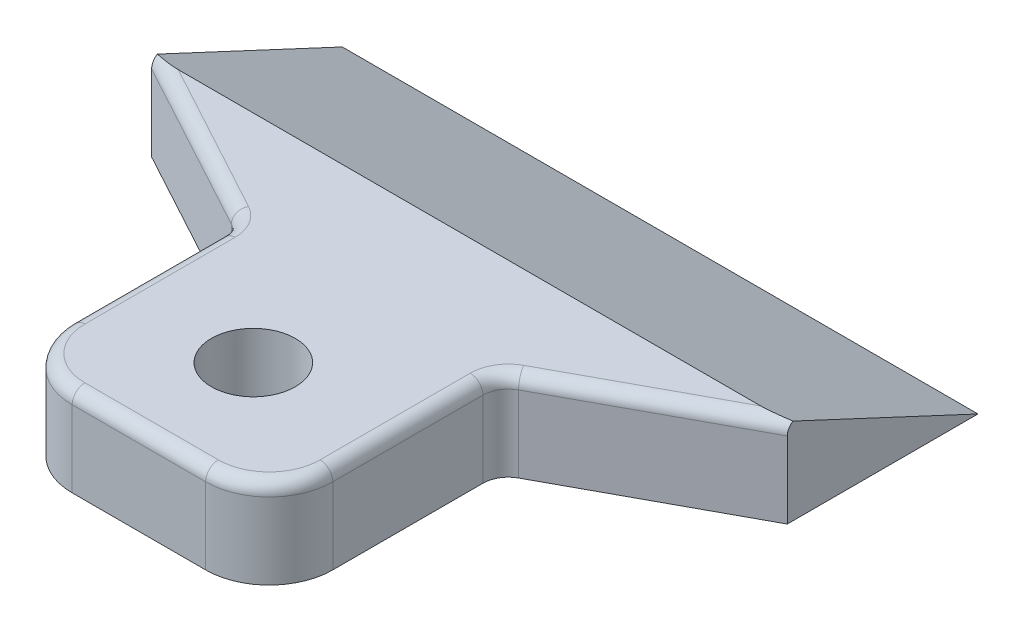
ISO-10303-21;
HEADER;
FILE_DESCRIPTION(('STEP AP214'),'2;1');
FILE_NAME('part.step','',(''),(''),'','','');
FILE_SCHEMA(('AUTOMOTIVE_DESIGN { 1 0 10303 214 1 1 1 1 }'));
ENDSEC;
DATA;
#1=APPLICATION_CONTEXT('core data for automotive mechanical design processes');
#2=APPLICATION_PROTOCOL_DEFINITION('international standard','automotive_design',2000,#1);
#3=PRODUCT_CONTEXT('',#1,'mechanical');
#4=PRODUCT('Part','Part','',(#3));
#5=PRODUCT_RELATED_PRODUCT_CATEGORY('part','',(#4));
#6=PRODUCT_DEFINITION_FORMATION('','',#4);
#7=PRODUCT_DEFINITION_CONTEXT('part definition',#1,'design');
#8=PRODUCT_DEFINITION('design','',#6,#7);
#9=PRODUCT_DEFINITION_SHAPE('','',#8);
#10=(LENGTH_UNIT() NAMED_UNIT(*) SI_UNIT(.MILLI.,.METRE.));
#11=(NAMED_UNIT(*) PLANE_ANGLE_UNIT() SI_UNIT($,.RADIAN.));
#12=(NAMED_UNIT(*) SI_UNIT($,.STERADIAN.) SOLID_ANGLE_UNIT());
#13=UNCERTAINTY_MEASURE_WITH_UNIT(LENGTH_MEASURE(1.E-05),#10,'distance_accuracy_value','');
#14=(GEOMETRIC_REPRESENTATION_CONTEXT(3) GLOBAL_UNCERTAINTY_ASSIGNED_CONTEXT((#13)) GLOBAL_UNIT_ASSIGNED_CONTEXT((#10,
#11,#12)) REPRESENTATION_CONTEXT('',''));
#15=CARTESIAN_POINT('',(0.,0.,0.));
#16=DIRECTION('',(0.,0.,1.));
#17=DIRECTION('',(1.,0.,0.));
#18=AXIS2_PLACEMENT_3D('',#15,#16,#17);
#19=CARTESIAN_POINT('',(5.25,0.,-5.));
#20=DIRECTION('',(0.,1.,0.));
#21=DIRECTION('',(0.,0.,1.));
#22=AXIS2_PLACEMENT_3D('',#19,#20,#21);
#23=PLANE('',#22);
#24=DIRECTION('',(0.,0.,1.));
#25=VECTOR('',#24,1.);
#26=CARTESIAN_POINT('',(-15.,0.,-5.));
#27=LINE('',#26,#25);
#28=CARTESIAN_POINT('',(-15.,0.,-41.));
#29=VERTEX_POINT('',#28);
#30=CARTESIAN_POINT('',(-15.,0.,-36.));
#31=VERTEX_POINT('',#30);
#32=EDGE_CURVE('E398',#29,#31,#27,.T.);
#33=ORIENTED_EDGE('',*,*,#32,.F.);
#34=DIRECTION('',(-1.,0.,0.));
#35=VECTOR('',#34,1.);
#36=CARTESIAN_POINT('',(25.,0.,-41.));
#37=LINE('',#36,#35);
#38=CARTESIAN_POINT('',(15.,0.,-41.));
#39=VERTEX_POINT('',#38);
#40=EDGE_CURVE('E333',#39,#29,#37,.T.);
#41=ORIENTED_EDGE('',*,*,#40,.F.);
#42=DIRECTION('',(0.,0.,-1.));
#43=VECTOR('',#42,1.);
#44=CARTESIAN_POINT('',(15.,0.,-5.));
#45=LINE('',#44,#43);
#46=CARTESIAN_POINT('',(15.,0.,-36.));
#47=VERTEX_POINT('',#46);
#48=EDGE_CURVE('E330',#47,#39,#45,.T.);
#49=ORIENTED_EDGE('',*,*,#48,.F.);
#50=DIRECTION('',(-1.,0.,0.));
#51=VECTOR('',#50,1.);
#52=CARTESIAN_POINT('',(5.25,0.,-36.));
#53=LINE('',#52,#51);
#54=CARTESIAN_POINT('',(25.,0.,-36.));
#55=VERTEX_POINT('',#54);
#56=EDGE_CURVE('E392',#55,#47,#53,.T.);
#57=ORIENTED_EDGE('',*,*,#56,.F.);
#58=DIRECTION('',(0.,0.,-1.));
#59=VECTOR('',#58,1.);
#60=CARTESIAN_POINT('',(25.,0.,-26.));
#61=LINE('',#60,#59);
#62=CARTESIAN_POINT('',(25.,0.,-26.));
#63=VERTEX_POINT('',#62);
#64=EDGE_CURVE('E324',#63,#55,#61,.T.);
#65=ORIENTED_EDGE('',*,*,#64,.F.);
#66=DIRECTION('',(1.,0.,0.));
#67=VECTOR('',#66,1.);
#68=CARTESIAN_POINT('',(5.25,0.,-26.));
#69=LINE('',#68,#67);
#70=CARTESIAN_POINT('',(-25.,0.,-26.));
#71=VERTEX_POINT('',#70);
#72=EDGE_CURVE('E372',#71,#63,#69,.T.);
#73=ORIENTED_EDGE('',*,*,#72,.F.);
#74=DIRECTION('',(0.,0.,1.));
#75=VECTOR('',#74,1.);
#76=CARTESIAN_POINT('',(-25.,0.,-26.));
#77=LINE('',#76,#75);
#78=CARTESIAN_POINT('',(-25.,0.,-36.));
#79=VERTEX_POINT('',#78);
#80=EDGE_CURVE('E332',#79,#71,#77,.T.);
#81=ORIENTED_EDGE('',*,*,#80,.F.);
#82=DIRECTION('',(-1.,0.,0.));
#83=VECTOR('',#82,1.);
#84=CARTESIAN_POINT('',(5.25,0.,-36.));
#85=LINE('',#84,#83);
#86=EDGE_CURVE('E395',#31,#79,#85,.T.);
#87=ORIENTED_EDGE('',*,*,#86,.F.);
#88=EDGE_LOOP('',(#33,#41,#49,#57,#65,#73,#81,#87));
#89=FACE_BOUND('',#88,.T.);
#90=ADVANCED_FACE('F166',(#89),#23,.F.);
#91=CARTESIAN_POINT('',(-25.,0.,-41.));
#92=VERTEX_POINT('',#91);
#93=EDGE_CURVE('E335',#29,#92,#37,.T.);
#94=ORIENTED_EDGE('',*,*,#93,.F.);
#95=ORIENTED_EDGE('',*,*,#32,.T.);
#96=ORIENTED_EDGE('',*,*,#86,.T.);
#97=EDGE_CURVE('E337',#92,#79,#77,.T.);
#98=ORIENTED_EDGE('',*,*,#97,.F.);
#99=EDGE_LOOP('',(#94,#95,#96,#98));
#100=FACE_BOUND('',#99,.T.);
#101=ADVANCED_FACE('F553',(#100),#23,.F.);
#102=CARTESIAN_POINT('',(25.,0.,-41.));
#103=VERTEX_POINT('',#102);
#104=EDGE_CURVE('E321',#55,#103,#61,.T.);
#105=ORIENTED_EDGE('',*,*,#104,.F.);
#106=ORIENTED_EDGE('',*,*,#56,.T.);
#107=ORIENTED_EDGE('',*,*,#48,.T.);
#108=EDGE_CURVE('E310',#103,#39,#37,.T.);
#109=ORIENTED_EDGE('',*,*,#108,.F.);
#110=EDGE_LOOP('',(#105,#106,#107,#109));
#111=FACE_BOUND('',#110,.T.);
#112=ADVANCED_FACE('F328',(#111),#23,.F.);
#113=CARTESIAN_POINT('',(0.,7.,-9.));
#114=DIRECTION('',(0.,-1.,0.));
#115=DIRECTION('',(0.,0.,-1.));
#116=AXIS2_PLACEMENT_3D('',#113,#114,#115);
#117=CYLINDRICAL_SURFACE('',#116,3.3);
#118=CARTESIAN_POINT('',(0.,7.,-9.));
#119=DIRECTION('',(0.,1.,0.));
#120=DIRECTION('',(0.,0.,1.));
#121=AXIS2_PLACEMENT_3D('',#118,#119,#120);
#122=CIRCLE('',#121,3.3);
#123=CARTESIAN_POINT('',(0.,7.,-5.7));
#124=VERTEX_POINT('',#123);
#125=EDGE_CURVE('E351',#124,#124,#122,.T.);
#126=ORIENTED_EDGE('',*,*,#125,.T.);
#127=EDGE_LOOP('',(#126));
#128=FACE_BOUND('',#127,.T.);
#129=CARTESIAN_POINT('',(0.,2.,-9.));
#130=DIRECTION('',(0.,-1.,0.));
#131=DIRECTION('',(0.,0.,-1.));
#132=AXIS2_PLACEMENT_3D('',#129,#130,#131);
#133=CIRCLE('',#132,3.3);
#134=CARTESIAN_POINT('',(0.,2.,-12.3));
#135=VERTEX_POINT('',#134);
#136=EDGE_CURVE('E317',#135,#135,#133,.T.);
#137=ORIENTED_EDGE('',*,*,#136,.T.);
#138=EDGE_LOOP('',(#137));
#139=FACE_BOUND('',#138,.T.);
#140=ADVANCED_FACE('F582',(#128,#139),#117,.F.);
#141=CARTESIAN_POINT('',(5.25,7.,-5.));
#142=DIRECTION('',(0.,1.,0.));
#143=DIRECTION('',(0.,0.,1.));
#144=AXIS2_PLACEMENT_3D('',#141,#142,#143);
#145=PLANE('',#144);
#146=DIRECTION('',(1.,0.,0.));
#147=VECTOR('',#146,1.);
#148=CARTESIAN_POINT('',(-25.,7.,-26.));
#149=LINE('',#148,#147);
#150=CARTESIAN_POINT('',(-22.9025219756813,7.,-26.));
#151=VERTEX_POINT('',#150);
#152=CARTESIAN_POINT('',(22.9025219756813,7.,-26.));
#153=VERTEX_POINT('',#152);
#154=EDGE_CURVE('E354',#151,#153,#149,.T.);
#155=ORIENTED_EDGE('',*,*,#154,.F.);
#156=DIRECTION('',(0.879031855696728,0.,0.476763040377887));
#157=VECTOR('',#156,1.);
#158=CARTESIAN_POINT('',(-10.8197108788663,7.,-19.446610930541));
#159=LINE('',#158,#157);
#160=CARTESIAN_POINT('',(-10.8197108788663,7.,-19.446610930541));
#161=VERTEX_POINT('',#160);
#162=EDGE_CURVE('E417',#151,#161,#159,.T.);
#163=ORIENTED_EDGE('',*,*,#162,.T.);
#164=CARTESIAN_POINT('',(-12.25,7.,-16.8095153634509));
#165=DIRECTION('',(0.,1.,0.));
#166=DIRECTION('',(0.,0.,1.));
#167=AXIS2_PLACEMENT_3D('',#164,#165,#166);
#168=CIRCLE('',#167,3.);
#169=CARTESIAN_POINT('',(-9.24999999999999,7.,-16.8095153634509));
#170=VERTEX_POINT('',#169);
#171=EDGE_CURVE('E415',#161,#170,#168,.F.);
#172=ORIENTED_EDGE('',*,*,#171,.T.);
#173=DIRECTION('',(0.,0.,1.));
#174=VECTOR('',#173,1.);
#175=CARTESIAN_POINT('',(-9.24999999999999,7.,-5.));
#176=LINE('',#175,#174);
#177=CARTESIAN_POINT('',(-9.24999999999999,7.,-5.));
#178=VERTEX_POINT('',#177);
#179=EDGE_CURVE('E401',#170,#178,#176,.T.);
#180=ORIENTED_EDGE('',*,*,#179,.T.);
#181=CARTESIAN_POINT('',(-5.24999999999999,7.,-5.));
#182=DIRECTION('',(0.,1.,0.));
#183=DIRECTION('',(0.,0.,1.));
#184=AXIS2_PLACEMENT_3D('',#181,#182,#183);
#185=CIRCLE('',#184,4.);
#186=CARTESIAN_POINT('',(-5.24999999999999,7.,-1.));
#187=VERTEX_POINT('',#186);
#188=EDGE_CURVE('E403',#178,#187,#185,.T.);
#189=ORIENTED_EDGE('',*,*,#188,.T.);
#190=DIRECTION('',(1.,0.,0.));
#191=VECTOR('',#190,1.);
#192=CARTESIAN_POINT('',(5.25,7.,-0.999999999999999));
#193=LINE('',#192,#191);
#194=CARTESIAN_POINT('',(5.25,7.,-0.999999999999999));
#195=VERTEX_POINT('',#194);
#196=EDGE_CURVE('E405',#187,#195,#193,.T.);
#197=ORIENTED_EDGE('',*,*,#196,.T.);
#198=CARTESIAN_POINT('',(5.25,7.,-5.));
#199=DIRECTION('',(0.,1.,0.));
#200=DIRECTION('',(0.,0.,1.));
#201=AXIS2_PLACEMENT_3D('',#198,#199,#200);
#202=CIRCLE('',#201,4.);
#203=CARTESIAN_POINT('',(9.25,7.,-5.));
#204=VERTEX_POINT('',#203);
#205=EDGE_CURVE('E407',#195,#204,#202,.T.);
#206=ORIENTED_EDGE('',*,*,#205,.T.);
#207=DIRECTION('',(0.,0.,-1.));
#208=VECTOR('',#207,1.);
#209=CARTESIAN_POINT('',(9.25,7.,-16.8095153634509));
#210=LINE('',#209,#208);
#211=CARTESIAN_POINT('',(9.25,7.,-16.8095153634509));
#212=VERTEX_POINT('',#211);
#213=EDGE_CURVE('E409',#204,#212,#210,.T.);
#214=ORIENTED_EDGE('',*,*,#213,.T.);
#215=CARTESIAN_POINT('',(12.25,7.,-16.8095153634509));
#216=DIRECTION('',(0.,1.,0.));
#217=DIRECTION('',(0.,0.,1.));
#218=AXIS2_PLACEMENT_3D('',#215,#216,#217);
#219=CIRCLE('',#218,3.);
#220=CARTESIAN_POINT('',(10.8197108788663,7.,-19.4466109305411));
#221=VERTEX_POINT('',#220);
#222=EDGE_CURVE('E411',#212,#221,#219,.F.);
#223=ORIENTED_EDGE('',*,*,#222,.T.);
#224=DIRECTION('',(0.879031855696728,0.,-0.476763040377887));
#225=VECTOR('',#224,1.);
#226=CARTESIAN_POINT('',(24.5232369596221,7.,-26.8790318556967));
#227=LINE('',#226,#225);
#228=EDGE_CURVE('E413',#221,#153,#227,.T.);
#229=ORIENTED_EDGE('',*,*,#228,.T.);
#230=EDGE_LOOP('',(#155,#163,#172,#180,#189,#197,#206,#214,#223,#229));
#231=FACE_BOUND('',#230,.T.);
#232=ORIENTED_EDGE('',*,*,#125,.F.);
#233=EDGE_LOOP('',(#232));
#234=FACE_BOUND('',#233,.T.);
#235=ADVANCED_FACE('F474',(#231,#234),#145,.T.);
#236=CARTESIAN_POINT('',(0.,0.,-9.));
#237=DIRECTION('',(0.,-1.,0.));
#238=DIRECTION('',(0.,0.,-1.));
#239=AXIS2_PLACEMENT_3D('',#236,#237,#238);
#240=CIRCLE('',#239,7.);
#241=CARTESIAN_POINT('',(0.,0.,-16.));
#242=VERTEX_POINT('',#241);
#243=EDGE_CURVE('E357',#242,#242,#240,.T.);
#244=ORIENTED_EDGE('',*,*,#243,.F.);
#245=EDGE_LOOP('',(#244));
#246=FACE_BOUND('',#245,.T.);
#247=DIRECTION('',(0.879031855696728,0.,0.476763040377887));
#248=VECTOR('',#247,1.);
#249=CARTESIAN_POINT('',(-10.25,0.,-18.));
#250=LINE('',#249,#248);
#251=CARTESIAN_POINT('',(-11.2964739192442,0.,-18.5675790748443));
#252=VERTEX_POINT('',#251);
#253=EDGE_CURVE('E504',#71,#252,#250,.T.);
#254=ORIENTED_EDGE('',*,*,#253,.F.);
#255=ORIENTED_EDGE('',*,*,#72,.T.);
#256=DIRECTION('',(0.879031855696728,0.,-0.476763040377887));
#257=VECTOR('',#256,1.);
#258=CARTESIAN_POINT('',(10.25,0.,-18.));
#259=LINE('',#258,#257);
#260=CARTESIAN_POINT('',(11.2964739192442,0.,-18.5675790748443));
#261=VERTEX_POINT('',#260);
#262=EDGE_CURVE('E326',#261,#63,#259,.T.);
#263=ORIENTED_EDGE('',*,*,#262,.F.);
#264=CARTESIAN_POINT('',(12.25,0.,-16.8095153634509));
#265=DIRECTION('',(0.,1.,0.));
#266=DIRECTION('',(0.,0.,1.));
#267=AXIS2_PLACEMENT_3D('',#264,#265,#266);
#268=CIRCLE('',#267,2.);
#269=CARTESIAN_POINT('',(10.25,0.,-16.8095153634509));
#270=VERTEX_POINT('',#269);
#271=EDGE_CURVE('E386',#261,#270,#268,.T.);
#272=ORIENTED_EDGE('',*,*,#271,.T.);
#273=DIRECTION('',(0.,0.,-1.));
#274=VECTOR('',#273,1.);
#275=CARTESIAN_POINT('',(10.25,0.,-5.));
#276=LINE('',#275,#274);
#277=CARTESIAN_POINT('',(10.25,0.,-5.));
#278=VERTEX_POINT('',#277);
#279=EDGE_CURVE('E345',#278,#270,#276,.T.);
#280=ORIENTED_EDGE('',*,*,#279,.F.);
#281=CARTESIAN_POINT('',(5.25,0.,-5.));
#282=DIRECTION('',(0.,1.,0.));
#283=DIRECTION('',(0.,0.,1.));
#284=AXIS2_PLACEMENT_3D('',#281,#282,#283);
#285=CIRCLE('',#284,5.);
#286=CARTESIAN_POINT('',(5.25,0.,0.));
#287=VERTEX_POINT('',#286);
#288=EDGE_CURVE('E348',#287,#278,#285,.T.);
#289=ORIENTED_EDGE('',*,*,#288,.F.);
#290=DIRECTION('',(1.,0.,0.));
#291=VECTOR('',#290,1.);
#292=CARTESIAN_POINT('',(-5.24999999999999,0.,0.));
#293=LINE('',#292,#291);
#294=CARTESIAN_POINT('',(-5.24999999999999,0.,0.));
#295=VERTEX_POINT('',#294);
#296=EDGE_CURVE('E516',#295,#287,#293,.T.);
#297=ORIENTED_EDGE('',*,*,#296,.F.);
#298=CARTESIAN_POINT('',(-5.24999999999999,0.,-5.));
#299=DIRECTION('',(0.,1.,0.));
#300=DIRECTION('',(0.,0.,1.));
#301=AXIS2_PLACEMENT_3D('',#298,#299,#300);
#302=CIRCLE('',#301,5.);
#303=CARTESIAN_POINT('',(-10.25,0.,-5.));
#304=VERTEX_POINT('',#303);
#305=EDGE_CURVE('E510',#304,#295,#302,.T.);
#306=ORIENTED_EDGE('',*,*,#305,.F.);
#307=DIRECTION('',(0.,0.,1.));
#308=VECTOR('',#307,1.);
#309=CARTESIAN_POINT('',(-10.25,0.,-18.));
#310=LINE('',#309,#308);
#311=CARTESIAN_POINT('',(-10.25,0.,-16.8095153634509));
#312=VERTEX_POINT('',#311);
#313=EDGE_CURVE('E507',#312,#304,#310,.T.);
#314=ORIENTED_EDGE('',*,*,#313,.F.);
#315=CARTESIAN_POINT('',(-12.25,0.,-16.8095153634509));
#316=DIRECTION('',(0.,1.,0.));
#317=DIRECTION('',(0.,0.,1.));
#318=AXIS2_PLACEMENT_3D('',#315,#316,#317);
#319=CIRCLE('',#318,2.);
#320=EDGE_CURVE('E388',#312,#252,#319,.T.);
#321=ORIENTED_EDGE('',*,*,#320,.T.);
#322=EDGE_LOOP('',(#254,#255,#263,#272,#280,#289,#297,#306,#314,#321));
#323=FACE_BOUND('',#322,.T.);
#324=ADVANCED_FACE('F537',(#246,#323),#23,.F.);
#325=CARTESIAN_POINT('',(5.25,7.,-5.));
#326=DIRECTION('',(0.,-1.,0.));
#327=DIRECTION('',(0.,0.,-1.));
#328=AXIS2_PLACEMENT_3D('',#325,#326,#327);
#329=CYLINDRICAL_SURFACE('',#328,5.);
#330=DIRECTION('',(0.,-1.,0.));
#331=VECTOR('',#330,1.);
#332=CARTESIAN_POINT('',(10.25,7.,-5.));
#333=LINE('',#332,#331);
#334=CARTESIAN_POINT('',(10.25,6.,-5.));
#335=VERTEX_POINT('',#334);
#336=EDGE_CURVE('E525',#335,#278,#333,.T.);
#337=ORIENTED_EDGE('',*,*,#336,.F.);
#338=CARTESIAN_POINT('',(5.25,6.,-5.));
#339=DIRECTION('',(0.,1.,0.));
#340=DIRECTION('',(0.,0.,1.));
#341=AXIS2_PLACEMENT_3D('',#338,#339,#340);
#342=CIRCLE('',#341,5.);
#343=CARTESIAN_POINT('',(5.25,6.,0.));
#344=VERTEX_POINT('',#343);
#345=EDGE_CURVE('E437',#335,#344,#342,.F.);
#346=ORIENTED_EDGE('',*,*,#345,.T.);
#347=DIRECTION('',(0.,-1.,0.));
#348=VECTOR('',#347,1.);
#349=CARTESIAN_POINT('',(5.25,7.,0.));
#350=LINE('',#349,#348);
#351=EDGE_CURVE('E370',#344,#287,#350,.T.);
#352=ORIENTED_EDGE('',*,*,#351,.T.);
#353=ORIENTED_EDGE('',*,*,#288,.T.);
#354=EDGE_LOOP('',(#337,#346,#352,#353));
#355=FACE_BOUND('',#354,.T.);
#356=ADVANCED_FACE('F529',(#355),#329,.T.);
#357=CARTESIAN_POINT('',(10.25,7.,-5.));
#358=DIRECTION('',(-1.,0.,0.));
#359=DIRECTION('',(0.,0.,1.));
#360=AXIS2_PLACEMENT_3D('',#357,#358,#359);
#361=PLANE('',#360);
#362=DIRECTION('',(0.,-1.,0.));
#363=VECTOR('',#362,1.);
#364=CARTESIAN_POINT('',(10.25,7.,-16.8095153634509));
#365=LINE('',#364,#363);
#366=CARTESIAN_POINT('',(10.25,6.,-16.8095153634509));
#367=VERTEX_POINT('',#366);
#368=EDGE_CURVE('E378',#270,#367,#365,.F.);
#369=ORIENTED_EDGE('',*,*,#368,.T.);
#370=DIRECTION('',(0.,0.,-1.));
#371=VECTOR('',#370,1.);
#372=CARTESIAN_POINT('',(10.25,6.,-5.));
#373=LINE('',#372,#371);
#374=EDGE_CURVE('E435',#367,#335,#373,.F.);
#375=ORIENTED_EDGE('',*,*,#374,.T.);
#376=ORIENTED_EDGE('',*,*,#336,.T.);
#377=ORIENTED_EDGE('',*,*,#279,.T.);
#378=EDGE_LOOP('',(#369,#375,#376,#377));
#379=FACE_BOUND('',#378,.T.);
#380=ADVANCED_FACE('F541',(#379),#361,.F.);
#381=CARTESIAN_POINT('',(10.25,7.,-18.));
#382=DIRECTION('',(-0.476763040377887,0.,-0.879031855696728));
#383=DIRECTION('',(-0.879031855696728,0.,0.476763040377887));
#384=AXIS2_PLACEMENT_3D('',#381,#382,#383);
#385=PLANE('',#384);
#386=DIRECTION('',(0.,-1.,0.));
#387=VECTOR('',#386,1.);
#388=CARTESIAN_POINT('',(25.,7.,-26.));
#389=LINE('',#388,#387);
#390=CARTESIAN_POINT('',(25.,6.,-26.));
#391=VERTEX_POINT('',#390);
#392=EDGE_CURVE('E524',#391,#63,#389,.T.);
#393=ORIENTED_EDGE('',*,*,#392,.F.);
#394=DIRECTION('',(0.879031855696728,0.,-0.476763040377887));
#395=VECTOR('',#394,1.);
#396=CARTESIAN_POINT('',(11.2964739192442,6.,-18.5675790748443));
#397=LINE('',#396,#395);
#398=CARTESIAN_POINT('',(11.2964739192442,6.,-18.5675790748443));
#399=VERTEX_POINT('',#398);
#400=EDGE_CURVE('E431',#391,#399,#397,.F.);
#401=ORIENTED_EDGE('',*,*,#400,.T.);
#402=DIRECTION('',(0.,-1.,0.));
#403=VECTOR('',#402,1.);
#404=CARTESIAN_POINT('',(11.2964739192442,0.,-18.5675790748443));
#405=LINE('',#404,#403);
#406=EDGE_CURVE('E376',#399,#261,#405,.T.);
#407=ORIENTED_EDGE('',*,*,#406,.T.);
#408=ORIENTED_EDGE('',*,*,#262,.T.);
#409=EDGE_LOOP('',(#393,#401,#407,#408));
#410=FACE_BOUND('',#409,.T.);
#411=ADVANCED_FACE('F547',(#410),#385,.F.);
#412=CARTESIAN_POINT('',(25.,7.,-26.));
#413=DIRECTION('',(-1.,0.,0.));
#414=DIRECTION('',(0.,0.,1.));
#415=AXIS2_PLACEMENT_3D('',#412,#413,#414);
#416=PLANE('',#415);
#417=DIRECTION('',(0.,-0.422885465331124,-0.906183139995265));
#418=VECTOR('',#417,1.);
#419=CARTESIAN_POINT('',(25.,7.,-26.));
#420=LINE('',#419,#418);
#421=CARTESIAN_POINT('',(25.,6.79272840476207,-26.444153418367));
#422=VERTEX_POINT('',#421);
#423=EDGE_CURVE('E304',#422,#103,#420,.T.);
#424=ORIENTED_EDGE('',*,*,#423,.F.);
#425=CARTESIAN_POINT('',(25.,6.,-27.1376151996305));
#426=DIRECTION('',(-1.,0.,0.));
#427=DIRECTION('',(0.,0.,1.));
#428=AXIS2_PLACEMENT_3D('',#425,#426,#427);
#429=ELLIPSE('',#428,1.1376151996305,1.);
#430=EDGE_CURVE('E429',#422,#391,#429,.F.);
#431=ORIENTED_EDGE('',*,*,#430,.T.);
#432=ORIENTED_EDGE('',*,*,#392,.T.);
#433=ORIENTED_EDGE('',*,*,#64,.T.);
#434=ORIENTED_EDGE('',*,*,#104,.T.);
#435=EDGE_LOOP('',(#424,#431,#432,#433,#434));
#436=FACE_BOUND('',#435,.T.);
#437=ADVANCED_FACE('F322',(#436),#416,.F.);
#438=CARTESIAN_POINT('',(-25.,7.,-26.));
#439=DIRECTION('',(1.,0.,0.));
#440=DIRECTION('',(0.,0.,-1.));
#441=AXIS2_PLACEMENT_3D('',#438,#439,#440);
#442=PLANE('',#441);
#443=DIRECTION('',(0.,-1.,0.));
#444=VECTOR('',#443,1.);
#445=CARTESIAN_POINT('',(-25.,7.,-26.));
#446=LINE('',#445,#444);
#447=CARTESIAN_POINT('',(-25.,6.,-26.));
#448=VERTEX_POINT('',#447);
#449=EDGE_CURVE('E505',#448,#71,#446,.T.);
#450=ORIENTED_EDGE('',*,*,#449,.F.);
#451=CARTESIAN_POINT('',(-25.,6.,-27.1376151996305));
#452=DIRECTION('',(1.,0.,0.));
#453=DIRECTION('',(0.,0.,-1.));
#454=AXIS2_PLACEMENT_3D('',#451,#452,#453);
#455=ELLIPSE('',#454,1.1376151996305,1.);
#456=CARTESIAN_POINT('',(-25.,6.79272840476207,-26.444153418367));
#457=VERTEX_POINT('',#456);
#458=EDGE_CURVE('E422',#448,#457,#455,.F.);
#459=ORIENTED_EDGE('',*,*,#458,.T.);
#460=DIRECTION('',(0.,-0.422885465331124,-0.906183139995265));
#461=VECTOR('',#460,1.);
#462=CARTESIAN_POINT('',(-25.,7.,-26.));
#463=LINE('',#462,#461);
#464=EDGE_CURVE('E316',#457,#92,#463,.T.);
#465=ORIENTED_EDGE('',*,*,#464,.T.);
#466=ORIENTED_EDGE('',*,*,#97,.T.);
#467=ORIENTED_EDGE('',*,*,#80,.T.);
#468=EDGE_LOOP('',(#450,#459,#465,#466,#467));
#469=FACE_BOUND('',#468,.T.);
#470=ADVANCED_FACE('F555',(#469),#442,.F.);
#471=CARTESIAN_POINT('',(-10.25,7.,-18.));
#472=DIRECTION('',(0.476763040377887,0.,-0.879031855696728));
#473=DIRECTION('',(-0.879031855696728,0.,-0.476763040377887));
#474=AXIS2_PLACEMENT_3D('',#471,#472,#473);
#475=PLANE('',#474);
#476=DIRECTION('',(0.,-1.,0.));
#477=VECTOR('',#476,1.);
#478=CARTESIAN_POINT('',(-11.2964739192442,7.,-18.5675790748443));
#479=LINE('',#478,#477);
#480=CARTESIAN_POINT('',(-11.2964739192442,6.,-18.5675790748443));
#481=VERTEX_POINT('',#480);
#482=EDGE_CURVE('E383',#252,#481,#479,.F.);
#483=ORIENTED_EDGE('',*,*,#482,.T.);
#484=DIRECTION('',(0.879031855696728,0.,0.476763040377887));
#485=VECTOR('',#484,1.);
#486=CARTESIAN_POINT('',(-25.,6.,-26.));
#487=LINE('',#486,#485);
#488=EDGE_CURVE('E420',#481,#448,#487,.F.);
#489=ORIENTED_EDGE('',*,*,#488,.T.);
#490=ORIENTED_EDGE('',*,*,#449,.T.);
#491=ORIENTED_EDGE('',*,*,#253,.T.);
#492=EDGE_LOOP('',(#483,#489,#490,#491));
#493=FACE_BOUND('',#492,.T.);
#494=ADVANCED_FACE('F501',(#493),#475,.F.);
#495=CARTESIAN_POINT('',(-10.25,7.,-18.));
#496=DIRECTION('',(1.,0.,0.));
#497=DIRECTION('',(0.,0.,-1.));
#498=AXIS2_PLACEMENT_3D('',#495,#496,#497);
#499=PLANE('',#498);
#500=DIRECTION('',(0.,-1.,0.));
#501=VECTOR('',#500,1.);
#502=CARTESIAN_POINT('',(-10.25,7.,-5.));
#503=LINE('',#502,#501);
#504=CARTESIAN_POINT('',(-10.25,6.,-5.));
#505=VERTEX_POINT('',#504);
#506=EDGE_CURVE('E521',#505,#304,#503,.T.);
#507=ORIENTED_EDGE('',*,*,#506,.F.);
#508=DIRECTION('',(0.,0.,1.));
#509=VECTOR('',#508,1.);
#510=CARTESIAN_POINT('',(-10.25,6.,-16.8095153634509));
#511=LINE('',#510,#509);
#512=CARTESIAN_POINT('',(-10.25,6.,-16.8095153634509));
#513=VERTEX_POINT('',#512);
#514=EDGE_CURVE('E14',#505,#513,#511,.F.);
#515=ORIENTED_EDGE('',*,*,#514,.T.);
#516=DIRECTION('',(0.,-1.,0.));
#517=VECTOR('',#516,1.);
#518=CARTESIAN_POINT('',(-10.25,0.,-16.8095153634509));
#519=LINE('',#518,#517);
#520=EDGE_CURVE('E381',#513,#312,#519,.T.);
#521=ORIENTED_EDGE('',*,*,#520,.T.);
#522=ORIENTED_EDGE('',*,*,#313,.T.);
#523=EDGE_LOOP('',(#507,#515,#521,#522));
#524=FACE_BOUND('',#523,.T.);
#525=ADVANCED_FACE('F562',(#524),#499,.F.);
#526=CARTESIAN_POINT('',(-5.24999999999999,7.,-5.));
#527=DIRECTION('',(0.,-1.,0.));
#528=DIRECTION('',(0.,0.,-1.));
#529=AXIS2_PLACEMENT_3D('',#526,#527,#528);
#530=CYLINDRICAL_SURFACE('',#529,5.);
#531=DIRECTION('',(0.,-1.,0.));
#532=VECTOR('',#531,1.);
#533=CARTESIAN_POINT('',(-5.24999999999999,7.,0.));
#534=LINE('',#533,#532);
#535=CARTESIAN_POINT('',(-5.24999999999999,6.,0.));
#536=VERTEX_POINT('',#535);
#537=EDGE_CURVE('E519',#536,#295,#534,.T.);
#538=ORIENTED_EDGE('',*,*,#537,.F.);
#539=CARTESIAN_POINT('',(-5.24999999999999,6.,-5.));
#540=DIRECTION('',(0.,1.,0.));
#541=DIRECTION('',(0.,0.,1.));
#542=AXIS2_PLACEMENT_3D('',#539,#540,#541);
#543=CIRCLE('',#542,5.);
#544=EDGE_CURVE('E175',#536,#505,#543,.F.);
#545=ORIENTED_EDGE('',*,*,#544,.T.);
#546=ORIENTED_EDGE('',*,*,#506,.T.);
#547=ORIENTED_EDGE('',*,*,#305,.T.);
#548=EDGE_LOOP('',(#538,#545,#546,#547));
#549=FACE_BOUND('',#548,.T.);
#550=ADVANCED_FACE('F729',(#549),#530,.T.);
#551=CARTESIAN_POINT('',(-5.24999999999999,7.,0.));
#552=DIRECTION('',(0.,0.,-1.));
#553=DIRECTION('',(-1.,0.,0.));
#554=AXIS2_PLACEMENT_3D('',#551,#552,#553);
#555=PLANE('',#554);
#556=ORIENTED_EDGE('',*,*,#351,.F.);
#557=DIRECTION('',(1.,0.,0.));
#558=VECTOR('',#557,1.);
#559=CARTESIAN_POINT('',(-5.24999999999999,6.,0.));
#560=LINE('',#559,#558);
#561=EDGE_CURVE('E190',#344,#536,#560,.F.);
#562=ORIENTED_EDGE('',*,*,#561,.T.);
#563=ORIENTED_EDGE('',*,*,#537,.T.);
#564=ORIENTED_EDGE('',*,*,#296,.T.);
#565=EDGE_LOOP('',(#556,#562,#563,#564));
#566=FACE_BOUND('',#565,.T.);
#567=ADVANCED_FACE('F535',(#566),#555,.F.);
#568=CARTESIAN_POINT('',(-25.,7.,-26.));
#569=DIRECTION('',(0.,-0.906183139995265,0.422885465331124));
#570=DIRECTION('',(0.,-0.422885465331124,-0.906183139995266));
#571=AXIS2_PLACEMENT_3D('',#568,#569,#570);
#572=PLANE('',#571);
#573=ORIENTED_EDGE('',*,*,#464,.F.);
#574=CARTESIAN_POINT('',(-26.8534148328241,6.,-28.1428571428571));
#575=DIRECTION('',(0.,-0.906183139995265,0.422885465331124));
#576=DIRECTION('',(-0.897461578436213,-0.186531665442637,-0.399710711662794));
#577=AXIS2_PLACEMENT_3D('',#574,#575,#576);
#578=ELLIPSE('',#577,4.95991987493914,1.);
#579=EDGE_CURVE('E425',#457,#151,#578,.F.);
#580=ORIENTED_EDGE('',*,*,#579,.T.);
#581=ORIENTED_EDGE('',*,*,#154,.T.);
#582=CARTESIAN_POINT('',(26.8534148328241,6.,-28.1428571428571));
#583=DIRECTION('',(0.,-0.906183139995265,0.422885465331124));
#584=DIRECTION('',(-0.897461578436213,0.186531665442638,0.399710711662795));
#585=AXIS2_PLACEMENT_3D('',#582,#583,#584);
#586=ELLIPSE('',#585,4.95991987493914,1.);
#587=EDGE_CURVE('E313',#153,#422,#586,.F.);
#588=ORIENTED_EDGE('',*,*,#587,.T.);
#589=ORIENTED_EDGE('',*,*,#423,.T.);
#590=ORIENTED_EDGE('',*,*,#108,.T.);
#591=ORIENTED_EDGE('',*,*,#40,.T.);
#592=ORIENTED_EDGE('',*,*,#93,.T.);
#593=EDGE_LOOP('',(#573,#580,#581,#588,#589,#590,#591,#592));
#594=FACE_BOUND('',#593,.T.);
#595=ADVANCED_FACE('F307',(#594),#572,.F.);
#596=CARTESIAN_POINT('',(0.,2.,-9.));
#597=DIRECTION('',(0.,-1.,0.));
#598=DIRECTION('',(0.,0.,-1.));
#599=AXIS2_PLACEMENT_3D('',#596,#597,#598);
#600=CYLINDRICAL_SURFACE('',#599,7.);
#601=CARTESIAN_POINT('',(0.,2.,-9.));
#602=DIRECTION('',(0.,-1.,0.));
#603=DIRECTION('',(0.,0.,-1.));
#604=AXIS2_PLACEMENT_3D('',#601,#602,#603);
#605=CIRCLE('',#604,7.);
#606=CARTESIAN_POINT('',(0.,2.,-16.));
#607=VERTEX_POINT('',#606);
#608=EDGE_CURVE('E360',#607,#607,#605,.T.);
#609=ORIENTED_EDGE('',*,*,#608,.F.);
#610=EDGE_LOOP('',(#609));
#611=FACE_BOUND('',#610,.T.);
#612=ORIENTED_EDGE('',*,*,#243,.T.);
#613=EDGE_LOOP('',(#612));
#614=FACE_BOUND('',#613,.T.);
#615=ADVANCED_FACE('F593',(#611,#614),#600,.F.);
#616=CARTESIAN_POINT('',(0.,2.,-9.));
#617=DIRECTION('',(0.,-1.,0.));
#618=DIRECTION('',(0.,0.,-1.));
#619=AXIS2_PLACEMENT_3D('',#616,#617,#618);
#620=PLANE('',#619);
#621=ORIENTED_EDGE('',*,*,#136,.F.);
#622=EDGE_LOOP('',(#621));
#623=FACE_BOUND('',#622,.T.);
#624=ORIENTED_EDGE('',*,*,#608,.T.);
#625=EDGE_LOOP('',(#624));
#626=FACE_BOUND('',#625,.T.);
#627=ADVANCED_FACE('F596',(#623,#626),#620,.T.);
#628=CARTESIAN_POINT('',(12.25,7.,-16.8095153634509));
#629=DIRECTION('',(0.,1.,0.));
#630=DIRECTION('',(0.,0.,1.));
#631=AXIS2_PLACEMENT_3D('',#628,#629,#630);
#632=CYLINDRICAL_SURFACE('',#631,2.);
#633=ORIENTED_EDGE('',*,*,#406,.F.);
#634=CARTESIAN_POINT('',(12.25,6.,-16.8095153634509));
#635=DIRECTION('',(0.,1.,0.));
#636=DIRECTION('',(0.,0.,1.));
#637=AXIS2_PLACEMENT_3D('',#634,#635,#636);
#638=CIRCLE('',#637,2.);
#639=EDGE_CURVE('E433',#399,#367,#638,.T.);
#640=ORIENTED_EDGE('',*,*,#639,.T.);
#641=ORIENTED_EDGE('',*,*,#368,.F.);
#642=ORIENTED_EDGE('',*,*,#271,.F.);
#643=EDGE_LOOP('',(#633,#640,#641,#642));
#644=FACE_BOUND('',#643,.T.);
#645=ADVANCED_FACE('F544',(#644),#632,.F.);
#646=CARTESIAN_POINT('',(-12.25,7.,-16.8095153634509));
#647=DIRECTION('',(0.,1.,0.));
#648=DIRECTION('',(0.,0.,1.));
#649=AXIS2_PLACEMENT_3D('',#646,#647,#648);
#650=CYLINDRICAL_SURFACE('',#649,2.);
#651=ORIENTED_EDGE('',*,*,#520,.F.);
#652=CARTESIAN_POINT('',(-12.25,6.,-16.8095153634509));
#653=DIRECTION('',(0.,1.,0.));
#654=DIRECTION('',(0.,0.,1.));
#655=AXIS2_PLACEMENT_3D('',#652,#653,#654);
#656=CIRCLE('',#655,2.);
#657=EDGE_CURVE('E427',#513,#481,#656,.T.);
#658=ORIENTED_EDGE('',*,*,#657,.T.);
#659=ORIENTED_EDGE('',*,*,#482,.F.);
#660=ORIENTED_EDGE('',*,*,#320,.F.);
#661=EDGE_LOOP('',(#651,#658,#659,#660));
#662=FACE_BOUND('',#661,.T.);
#663=ADVANCED_FACE('F497',(#662),#650,.F.);
#664=CARTESIAN_POINT('',(0.461583241531104,6.,-13.828643398427));
#665=DIRECTION('',(-0.879031855696728,0.,0.476763040377887));
#666=DIRECTION('',(0.476763040377887,0.,0.879031855696728));
#667=AXIS2_PLACEMENT_3D('',#664,#665,#666);
#668=CYLINDRICAL_SURFACE('',#667,1.);
#669=ORIENTED_EDGE('',*,*,#587,.F.);
#670=ORIENTED_EDGE('',*,*,#228,.F.);
#671=CARTESIAN_POINT('',(10.8197108788663,6.,-19.4466109305411));
#672=DIRECTION('',(-0.879031855696728,0.,0.476763040377887));
#673=DIRECTION('',(0.476763040377887,0.,0.879031855696728));
#674=AXIS2_PLACEMENT_3D('',#671,#672,#673);
#675=CIRCLE('',#674,1.);
#676=EDGE_CURVE('E170',#399,#221,#675,.T.);
#677=ORIENTED_EDGE('',*,*,#676,.F.);
#678=ORIENTED_EDGE('',*,*,#400,.F.);
#679=ORIENTED_EDGE('',*,*,#430,.F.);
#680=EDGE_LOOP('',(#669,#670,#677,#678,#679));
#681=FACE_BOUND('',#680,.T.);
#682=ADVANCED_FACE('F168',(#681),#668,.T.);
#683=CARTESIAN_POINT('',(12.25,6.,-16.8095153634509));
#684=DIRECTION('',(0.,1.,0.));
#685=DIRECTION('',(0.,0.,1.));
#686=AXIS2_PLACEMENT_3D('',#683,#684,#685);
#687=TOROIDAL_SURFACE('',#686,3.,1.);
#688=ORIENTED_EDGE('',*,*,#676,.T.);
#689=ORIENTED_EDGE('',*,*,#222,.F.);
#690=CARTESIAN_POINT('',(9.25,6.,-16.8095153634509));
#691=DIRECTION('',(0.,0.,1.));
#692=DIRECTION('',(1.,0.,0.));
#693=AXIS2_PLACEMENT_3D('',#690,#691,#692);
#694=CIRCLE('',#693,1.);
#695=EDGE_CURVE('E457',#367,#212,#694,.T.);
#696=ORIENTED_EDGE('',*,*,#695,.F.);
#697=ORIENTED_EDGE('',*,*,#639,.F.);
#698=EDGE_LOOP('',(#688,#689,#696,#697));
#699=FACE_BOUND('',#698,.T.);
#700=ADVANCED_FACE('F468',(#699),#687,.T.);
#701=CARTESIAN_POINT('',(9.25,6.,-5.));
#702=DIRECTION('',(0.,0.,1.));
#703=DIRECTION('',(1.,0.,0.));
#704=AXIS2_PLACEMENT_3D('',#701,#702,#703);
#705=CYLINDRICAL_SURFACE('',#704,1.);
#706=ORIENTED_EDGE('',*,*,#695,.T.);
#707=ORIENTED_EDGE('',*,*,#213,.F.);
#708=CARTESIAN_POINT('',(9.25,6.,-5.));
#709=DIRECTION('',(0.,0.,1.));
#710=DIRECTION('',(1.,0.,0.));
#711=AXIS2_PLACEMENT_3D('',#708,#709,#710);
#712=CIRCLE('',#711,1.);
#713=EDGE_CURVE('E455',#335,#204,#712,.T.);
#714=ORIENTED_EDGE('',*,*,#713,.F.);
#715=ORIENTED_EDGE('',*,*,#374,.F.);
#716=EDGE_LOOP('',(#706,#707,#714,#715));
#717=FACE_BOUND('',#716,.T.);
#718=ADVANCED_FACE('F627',(#717),#705,.T.);
#719=CARTESIAN_POINT('',(5.25,6.,-5.));
#720=DIRECTION('',(0.,1.,0.));
#721=DIRECTION('',(0.,0.,1.));
#722=AXIS2_PLACEMENT_3D('',#719,#720,#721);
#723=TOROIDAL_SURFACE('',#722,4.,1.);
#724=ORIENTED_EDGE('',*,*,#713,.T.);
#725=ORIENTED_EDGE('',*,*,#205,.F.);
#726=CARTESIAN_POINT('',(5.25,6.,-1.));
#727=DIRECTION('',(-1.,0.,0.));
#728=DIRECTION('',(0.,0.,1.));
#729=AXIS2_PLACEMENT_3D('',#726,#727,#728);
#730=CIRCLE('',#729,1.);
#731=EDGE_CURVE('E452',#344,#195,#730,.T.);
#732=ORIENTED_EDGE('',*,*,#731,.F.);
#733=ORIENTED_EDGE('',*,*,#345,.F.);
#734=EDGE_LOOP('',(#724,#725,#732,#733));
#735=FACE_BOUND('',#734,.T.);
#736=ADVANCED_FACE('F623',(#735),#723,.T.);
#737=CARTESIAN_POINT('',(5.25,6.,-0.999999999999999));
#738=DIRECTION('',(-1.,0.,0.));
#739=DIRECTION('',(0.,0.,1.));
#740=AXIS2_PLACEMENT_3D('',#737,#738,#739);
#741=CYLINDRICAL_SURFACE('',#740,1.);
#742=ORIENTED_EDGE('',*,*,#731,.T.);
#743=ORIENTED_EDGE('',*,*,#196,.F.);
#744=CARTESIAN_POINT('',(-5.24999999999999,6.,-1.));
#745=DIRECTION('',(-1.,0.,0.));
#746=DIRECTION('',(0.,0.,1.));
#747=AXIS2_PLACEMENT_3D('',#744,#745,#746);
#748=CIRCLE('',#747,1.);
#749=EDGE_CURVE('E449',#536,#187,#748,.T.);
#750=ORIENTED_EDGE('',*,*,#749,.F.);
#751=ORIENTED_EDGE('',*,*,#561,.F.);
#752=EDGE_LOOP('',(#742,#743,#750,#751));
#753=FACE_BOUND('',#752,.T.);
#754=ADVANCED_FACE('F619',(#753),#741,.T.);
#755=CARTESIAN_POINT('',(-5.24999999999999,6.,-5.));
#756=DIRECTION('',(0.,1.,0.));
#757=DIRECTION('',(0.,0.,1.));
#758=AXIS2_PLACEMENT_3D('',#755,#756,#757);
#759=TOROIDAL_SURFACE('',#758,4.,1.);
#760=ORIENTED_EDGE('',*,*,#749,.T.);
#761=ORIENTED_EDGE('',*,*,#188,.F.);
#762=CARTESIAN_POINT('',(-9.24999999999999,6.,-5.));
#763=DIRECTION('',(0.,0.,-1.));
#764=DIRECTION('',(-1.,0.,0.));
#765=AXIS2_PLACEMENT_3D('',#762,#763,#764);
#766=CIRCLE('',#765,1.);
#767=EDGE_CURVE('E446',#505,#178,#766,.T.);
#768=ORIENTED_EDGE('',*,*,#767,.F.);
#769=ORIENTED_EDGE('',*,*,#544,.F.);
#770=EDGE_LOOP('',(#760,#761,#768,#769));
#771=FACE_BOUND('',#770,.T.);
#772=ADVANCED_FACE('F616',(#771),#759,.T.);
#773=CARTESIAN_POINT('',(-9.24999999999999,6.,-5.));
#774=DIRECTION('',(0.,0.,-1.));
#775=DIRECTION('',(-1.,0.,0.));
#776=AXIS2_PLACEMENT_3D('',#773,#774,#775);
#777=CYLINDRICAL_SURFACE('',#776,1.);
#778=ORIENTED_EDGE('',*,*,#767,.T.);
#779=ORIENTED_EDGE('',*,*,#179,.F.);
#780=CARTESIAN_POINT('',(-9.24999999999999,6.,-16.8095153634509));
#781=DIRECTION('',(0.,0.,-1.));
#782=DIRECTION('',(-1.,0.,0.));
#783=AXIS2_PLACEMENT_3D('',#780,#781,#782);
#784=CIRCLE('',#783,1.);
#785=EDGE_CURVE('E443',#513,#170,#784,.T.);
#786=ORIENTED_EDGE('',*,*,#785,.F.);
#787=ORIENTED_EDGE('',*,*,#514,.F.);
#788=EDGE_LOOP('',(#778,#779,#786,#787));
#789=FACE_BOUND('',#788,.T.);
#790=ADVANCED_FACE('F489',(#789),#777,.T.);
#791=CARTESIAN_POINT('',(-12.25,6.,-16.8095153634509));
#792=DIRECTION('',(0.,1.,0.));
#793=DIRECTION('',(0.,0.,1.));
#794=AXIS2_PLACEMENT_3D('',#791,#792,#793);
#795=TOROIDAL_SURFACE('',#794,3.,1.);
#796=ORIENTED_EDGE('',*,*,#785,.T.);
#797=ORIENTED_EDGE('',*,*,#171,.F.);
#798=CARTESIAN_POINT('',(-10.8197108788663,6.,-19.446610930541));
#799=DIRECTION('',(-0.879031855696728,0.,-0.476763040377887));
#800=DIRECTION('',(-0.476763040377887,0.,0.879031855696728));
#801=AXIS2_PLACEMENT_3D('',#798,#799,#800);
#802=CIRCLE('',#801,1.);
#803=EDGE_CURVE('E441',#481,#161,#802,.T.);
#804=ORIENTED_EDGE('',*,*,#803,.F.);
#805=ORIENTED_EDGE('',*,*,#657,.F.);
#806=EDGE_LOOP('',(#796,#797,#804,#805));
#807=FACE_BOUND('',#806,.T.);
#808=ADVANCED_FACE('F493',(#807),#795,.T.);
#809=CARTESIAN_POINT('',(7.65173529343005,6.,-9.42819944726165));
#810=DIRECTION('',(-0.879031855696728,0.,-0.476763040377887));
#811=DIRECTION('',(-0.476763040377887,0.,0.879031855696728));
#812=AXIS2_PLACEMENT_3D('',#809,#810,#811);
#813=CYLINDRICAL_SURFACE('',#812,1.);
#814=ORIENTED_EDGE('',*,*,#458,.F.);
#815=ORIENTED_EDGE('',*,*,#488,.F.);
#816=ORIENTED_EDGE('',*,*,#803,.T.);
#817=ORIENTED_EDGE('',*,*,#162,.F.);
#818=ORIENTED_EDGE('',*,*,#579,.F.);
#819=EDGE_LOOP('',(#814,#815,#816,#817,#818));
#820=FACE_BOUND('',#819,.T.);
#821=ADVANCED_FACE('F480',(#820),#813,.T.);
#822=CLOSED_SHELL('',(#90,#101,#112,#140,#235,#324,#356,#380,#411,#437,#470,#494,#525,#550,#567,
#595,#615,#627,#645,#663,#682,#700,#718,#736,#754,#772,#790,#808,#821));
#823=MANIFOLD_SOLID_BREP('B2',#822);
#824=ADVANCED_BREP_SHAPE_REPRESENTATION('',(#18,#823),#14);
#825=SHAPE_DEFINITION_REPRESENTATION(#9,#824);
ENDSEC;
END-ISO-10303-21;
